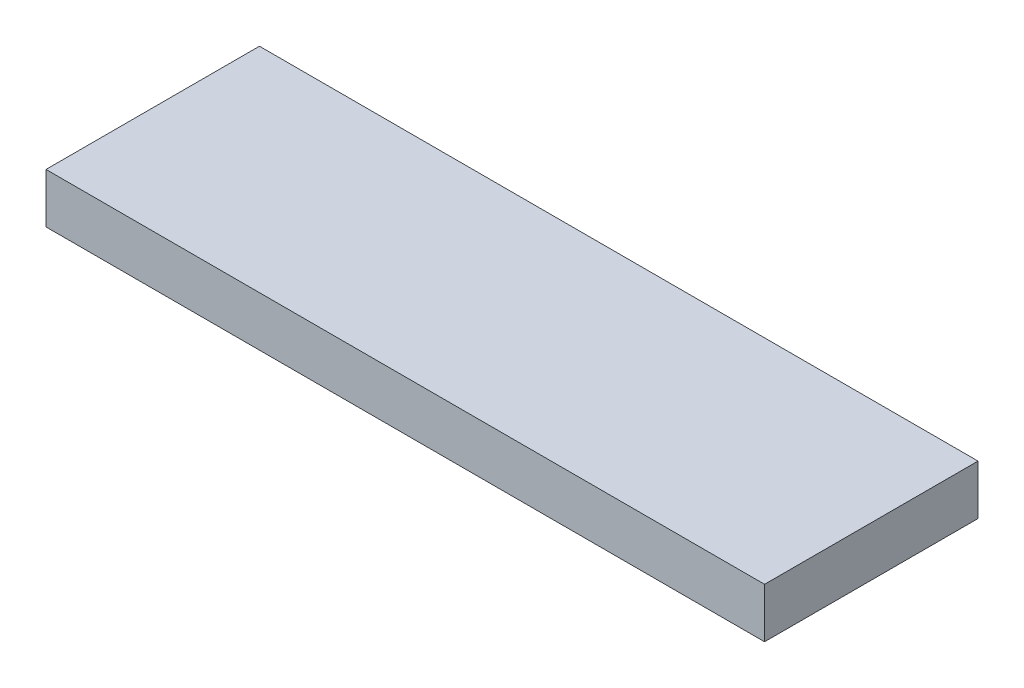
ISO-10303-21;
HEADER;
FILE_DESCRIPTION(('STEP AP214'),'2;1');
FILE_NAME('part.step','',(''),(''),'','','');
FILE_SCHEMA(('AUTOMOTIVE_DESIGN { 1 0 10303 214 1 1 1 1 }'));
ENDSEC;
DATA;
#1=APPLICATION_CONTEXT('core data for automotive mechanical design processes');
#2=APPLICATION_PROTOCOL_DEFINITION('international standard','automotive_design',2000,#1);
#3=PRODUCT_CONTEXT('',#1,'mechanical');
#4=PRODUCT('Part','Part','',(#3));
#5=PRODUCT_RELATED_PRODUCT_CATEGORY('part','',(#4));
#6=PRODUCT_DEFINITION_FORMATION('','',#4);
#7=PRODUCT_DEFINITION_CONTEXT('part definition',#1,'design');
#8=PRODUCT_DEFINITION('design','',#6,#7);
#9=PRODUCT_DEFINITION_SHAPE('','',#8);
#10=(LENGTH_UNIT() NAMED_UNIT(*) SI_UNIT(.MILLI.,.METRE.));
#11=(NAMED_UNIT(*) PLANE_ANGLE_UNIT() SI_UNIT($,.RADIAN.));
#12=(NAMED_UNIT(*) SI_UNIT($,.STERADIAN.) SOLID_ANGLE_UNIT());
#13=UNCERTAINTY_MEASURE_WITH_UNIT(LENGTH_MEASURE(1.E-05),#10,'distance_accuracy_value','');
#14=(GEOMETRIC_REPRESENTATION_CONTEXT(3) GLOBAL_UNCERTAINTY_ASSIGNED_CONTEXT((#13)) GLOBAL_UNIT_ASSIGNED_CONTEXT((#10,
#11,#12)) REPRESENTATION_CONTEXT('',''));
#15=CARTESIAN_POINT('',(0.,0.,0.));
#16=DIRECTION('',(0.,0.,1.));
#17=DIRECTION('',(1.,0.,0.));
#18=AXIS2_PLACEMENT_3D('',#15,#16,#17);
#19=CARTESIAN_POINT('',(538.999999999999,-40.,-1170.));
#20=DIRECTION('',(0.,-1.,0.));
#21=DIRECTION('',(0.,0.,-1.));
#22=AXIS2_PLACEMENT_3D('',#19,#20,#21);
#23=CYLINDRICAL_SURFACE('',#22,4.);
#24=CARTESIAN_POINT('',(538.999999999999,-40.,-1170.));
#25=DIRECTION('',(0.,-1.,0.));
#26=DIRECTION('',(0.,0.,-1.));
#27=AXIS2_PLACEMENT_3D('',#24,#25,#26);
#28=CIRCLE('',#27,4.);
#29=CARTESIAN_POINT('',(538.999999999999,-40.,-1174.));
#30=VERTEX_POINT('',#29);
#31=EDGE_CURVE('E104',#30,#30,#28,.F.);
#32=ORIENTED_EDGE('',*,*,#31,.F.);
#33=EDGE_LOOP('',(#32));
#34=FACE_BOUND('',#33,.T.);
#35=CARTESIAN_POINT('',(538.999999999999,-30.,-1170.));
#36=DIRECTION('',(0.,-1.,0.));
#37=DIRECTION('',(0.,0.,-1.));
#38=AXIS2_PLACEMENT_3D('',#35,#36,#37);
#39=CIRCLE('',#38,4.);
#40=CARTESIAN_POINT('',(538.999999999999,-30.,-1174.));
#41=VERTEX_POINT('',#40);
#42=EDGE_CURVE('E45',#41,#41,#39,.T.);
#43=ORIENTED_EDGE('',*,*,#42,.F.);
#44=EDGE_LOOP('',(#43));
#45=FACE_BOUND('',#44,.T.);
#46=ADVANCED_FACE('F42',(#34,#45),#23,.F.);
#47=CARTESIAN_POINT('',(469.,-40.,-1170.));
#48=DIRECTION('',(0.,-1.,0.));
#49=DIRECTION('',(0.,0.,-1.));
#50=AXIS2_PLACEMENT_3D('',#47,#48,#49);
#51=CYLINDRICAL_SURFACE('',#50,3.40000000000007);
#52=CARTESIAN_POINT('',(469.,-40.,-1170.));
#53=DIRECTION('',(0.,-1.,0.));
#54=DIRECTION('',(0.,0.,-1.));
#55=AXIS2_PLACEMENT_3D('',#52,#53,#54);
#56=CIRCLE('',#55,3.40000000000007);
#57=CARTESIAN_POINT('',(469.,-40.,-1173.4));
#58=VERTEX_POINT('',#57);
#59=EDGE_CURVE('E131',#58,#58,#56,.F.);
#60=ORIENTED_EDGE('',*,*,#59,.F.);
#61=EDGE_LOOP('',(#60));
#62=FACE_BOUND('',#61,.T.);
#63=CARTESIAN_POINT('',(469.,-30.,-1170.));
#64=DIRECTION('',(0.,-1.,0.));
#65=DIRECTION('',(0.,0.,-1.));
#66=AXIS2_PLACEMENT_3D('',#63,#64,#65);
#67=CIRCLE('',#66,3.40000000000007);
#68=CARTESIAN_POINT('',(469.,-30.,-1173.4));
#69=VERTEX_POINT('',#68);
#70=EDGE_CURVE('E137',#69,#69,#67,.T.);
#71=ORIENTED_EDGE('',*,*,#70,.F.);
#72=EDGE_LOOP('',(#71));
#73=FACE_BOUND('',#72,.T.);
#74=ADVANCED_FACE('F147',(#62,#73),#51,.F.);
#75=CARTESIAN_POINT('',(609.,-40.,-1170.));
#76=DIRECTION('',(0.,-1.,0.));
#77=DIRECTION('',(0.,0.,-1.));
#78=AXIS2_PLACEMENT_3D('',#75,#76,#77);
#79=CYLINDRICAL_SURFACE('',#78,3.40000000000007);
#80=CARTESIAN_POINT('',(609.,-40.,-1170.));
#81=DIRECTION('',(0.,-1.,0.));
#82=DIRECTION('',(0.,0.,-1.));
#83=AXIS2_PLACEMENT_3D('',#80,#81,#82);
#84=CIRCLE('',#83,3.40000000000007);
#85=CARTESIAN_POINT('',(609.,-40.,-1173.4));
#86=VERTEX_POINT('',#85);
#87=EDGE_CURVE('E123',#86,#86,#84,.F.);
#88=ORIENTED_EDGE('',*,*,#87,.F.);
#89=EDGE_LOOP('',(#88));
#90=FACE_BOUND('',#89,.T.);
#91=CARTESIAN_POINT('',(609.,-30.,-1170.));
#92=DIRECTION('',(0.,-1.,0.));
#93=DIRECTION('',(0.,0.,-1.));
#94=AXIS2_PLACEMENT_3D('',#91,#92,#93);
#95=CIRCLE('',#94,3.40000000000007);
#96=CARTESIAN_POINT('',(609.,-30.,-1173.4));
#97=VERTEX_POINT('',#96);
#98=EDGE_CURVE('E128',#97,#97,#95,.T.);
#99=ORIENTED_EDGE('',*,*,#98,.F.);
#100=EDGE_LOOP('',(#99));
#101=FACE_BOUND('',#100,.T.);
#102=ADVANCED_FACE('F152',(#90,#101),#79,.F.);
#103=CARTESIAN_POINT('',(640.,-40.,-1140.));
#104=DIRECTION('',(0.,0.,-1.));
#105=DIRECTION('',(0.,1.,0.));
#106=AXIS2_PLACEMENT_3D('',#103,#104,#105);
#107=PLANE('',#106);
#108=DIRECTION('',(0.,1.,0.));
#109=VECTOR('',#108,1.);
#110=CARTESIAN_POINT('',(438.,-40.,-1140.));
#111=LINE('',#110,#109);
#112=CARTESIAN_POINT('',(438.,-26.,-1140.));
#113=VERTEX_POINT('',#112);
#114=CARTESIAN_POINT('',(438.,-40.,-1140.));
#115=VERTEX_POINT('',#114);
#116=EDGE_CURVE('E84',#113,#115,#111,.F.);
#117=ORIENTED_EDGE('',*,*,#116,.T.);
#118=DIRECTION('',(1.,0.,0.));
#119=VECTOR('',#118,1.);
#120=CARTESIAN_POINT('',(0.,-40.,-1140.));
#121=LINE('',#120,#119);
#122=CARTESIAN_POINT('',(640.,-40.,-1140.));
#123=VERTEX_POINT('',#122);
#124=EDGE_CURVE('E75',#123,#115,#121,.F.);
#125=ORIENTED_EDGE('',*,*,#124,.F.);
#126=DIRECTION('',(0.,1.,0.));
#127=VECTOR('',#126,1.);
#128=CARTESIAN_POINT('',(640.,-40.,-1140.));
#129=LINE('',#128,#127);
#130=CARTESIAN_POINT('',(640.,-26.,-1140.));
#131=VERTEX_POINT('',#130);
#132=EDGE_CURVE('E98',#123,#131,#129,.T.);
#133=ORIENTED_EDGE('',*,*,#132,.T.);
#134=DIRECTION('',(1.,0.,0.));
#135=VECTOR('',#134,1.);
#136=CARTESIAN_POINT('',(438.,-26.,-1140.));
#137=LINE('',#136,#135);
#138=EDGE_CURVE('E102',#113,#131,#137,.T.);
#139=ORIENTED_EDGE('',*,*,#138,.F.);
#140=EDGE_LOOP('',(#117,#125,#133,#139));
#141=FACE_BOUND('',#140,.T.);
#142=ADVANCED_FACE('F100',(#141),#107,.F.);
#143=CARTESIAN_POINT('',(438.,-40.,-1140.));
#144=DIRECTION('',(1.,0.,0.));
#145=DIRECTION('',(0.,0.,-1.));
#146=AXIS2_PLACEMENT_3D('',#143,#144,#145);
#147=PLANE('',#146);
#148=DIRECTION('',(0.,-1.,0.));
#149=VECTOR('',#148,1.);
#150=CARTESIAN_POINT('',(438.,-40.,-1200.));
#151=LINE('',#150,#149);
#152=CARTESIAN_POINT('',(438.,-26.,-1200.));
#153=VERTEX_POINT('',#152);
#154=CARTESIAN_POINT('',(438.,-40.,-1200.));
#155=VERTEX_POINT('',#154);
#156=EDGE_CURVE('E91',#153,#155,#151,.T.);
#157=ORIENTED_EDGE('',*,*,#156,.T.);
#158=DIRECTION('',(0.,0.,-1.));
#159=VECTOR('',#158,1.);
#160=CARTESIAN_POINT('',(438.,-40.,0.));
#161=LINE('',#160,#159);
#162=EDGE_CURVE('E120',#115,#155,#161,.T.);
#163=ORIENTED_EDGE('',*,*,#162,.F.);
#164=ORIENTED_EDGE('',*,*,#116,.F.);
#165=DIRECTION('',(0.,0.,1.));
#166=VECTOR('',#165,1.);
#167=CARTESIAN_POINT('',(438.,-26.,-1200.));
#168=LINE('',#167,#166);
#169=EDGE_CURVE('E113',#153,#113,#168,.T.);
#170=ORIENTED_EDGE('',*,*,#169,.F.);
#171=EDGE_LOOP('',(#157,#163,#164,#170));
#172=FACE_BOUND('',#171,.T.);
#173=ADVANCED_FACE('F173',(#172),#147,.F.);
#174=CARTESIAN_POINT('',(640.,-40.,-1200.));
#175=DIRECTION('',(0.,0.,1.));
#176=DIRECTION('',(0.,-1.,0.));
#177=AXIS2_PLACEMENT_3D('',#174,#175,#176);
#178=PLANE('',#177);
#179=DIRECTION('',(0.,1.,0.));
#180=VECTOR('',#179,1.);
#181=CARTESIAN_POINT('',(640.,-40.,-1200.));
#182=LINE('',#181,#180);
#183=CARTESIAN_POINT('',(640.,-26.,-1200.));
#184=VERTEX_POINT('',#183);
#185=CARTESIAN_POINT('',(640.,-40.,-1200.));
#186=VERTEX_POINT('',#185);
#187=EDGE_CURVE('E62',#184,#186,#182,.F.);
#188=ORIENTED_EDGE('',*,*,#187,.T.);
#189=DIRECTION('',(1.,0.,0.));
#190=VECTOR('',#189,1.);
#191=CARTESIAN_POINT('',(0.,-40.,-1200.));
#192=LINE('',#191,#190);
#193=EDGE_CURVE('E51',#155,#186,#192,.T.);
#194=ORIENTED_EDGE('',*,*,#193,.F.);
#195=ORIENTED_EDGE('',*,*,#156,.F.);
#196=DIRECTION('',(-1.,0.,0.));
#197=VECTOR('',#196,1.);
#198=CARTESIAN_POINT('',(640.,-26.,-1200.));
#199=LINE('',#198,#197);
#200=EDGE_CURVE('E110',#184,#153,#199,.T.);
#201=ORIENTED_EDGE('',*,*,#200,.F.);
#202=EDGE_LOOP('',(#188,#194,#195,#201));
#203=FACE_BOUND('',#202,.T.);
#204=ADVANCED_FACE('F166',(#203),#178,.F.);
#205=CARTESIAN_POINT('',(640.,-40.,-1140.));
#206=DIRECTION('',(-1.,0.,0.));
#207=DIRECTION('',(0.,0.,1.));
#208=AXIS2_PLACEMENT_3D('',#205,#206,#207);
#209=PLANE('',#208);
#210=ORIENTED_EDGE('',*,*,#132,.F.);
#211=DIRECTION('',(0.,0.,-1.));
#212=VECTOR('',#211,1.);
#213=CARTESIAN_POINT('',(640.,-40.,0.));
#214=LINE('',#213,#212);
#215=EDGE_CURVE('E11',#186,#123,#214,.F.);
#216=ORIENTED_EDGE('',*,*,#215,.F.);
#217=ORIENTED_EDGE('',*,*,#187,.F.);
#218=DIRECTION('',(0.,0.,-1.));
#219=VECTOR('',#218,1.);
#220=CARTESIAN_POINT('',(640.,-26.,-1140.));
#221=LINE('',#220,#219);
#222=EDGE_CURVE('E107',#131,#184,#221,.T.);
#223=ORIENTED_EDGE('',*,*,#222,.F.);
#224=EDGE_LOOP('',(#210,#216,#217,#223));
#225=FACE_BOUND('',#224,.T.);
#226=ADVANCED_FACE('F108',(#225),#209,.F.);
#227=CARTESIAN_POINT('',(0.,-40.,0.));
#228=DIRECTION('',(0.,-1.,0.));
#229=DIRECTION('',(0.,0.,-1.));
#230=AXIS2_PLACEMENT_3D('',#227,#228,#229);
#231=PLANE('',#230);
#232=ORIENTED_EDGE('',*,*,#193,.T.);
#233=ORIENTED_EDGE('',*,*,#215,.T.);
#234=ORIENTED_EDGE('',*,*,#124,.T.);
#235=ORIENTED_EDGE('',*,*,#162,.T.);
#236=EDGE_LOOP('',(#232,#233,#234,#235));
#237=FACE_BOUND('',#236,.T.);
#238=ORIENTED_EDGE('',*,*,#87,.T.);
#239=EDGE_LOOP('',(#238));
#240=FACE_BOUND('',#239,.T.);
#241=ORIENTED_EDGE('',*,*,#59,.T.);
#242=EDGE_LOOP('',(#241));
#243=FACE_BOUND('',#242,.T.);
#244=ORIENTED_EDGE('',*,*,#31,.T.);
#245=EDGE_LOOP('',(#244));
#246=FACE_BOUND('',#245,.T.);
#247=ADVANCED_FACE('F157',(#237,#240,#243,#246),#231,.T.);
#248=CARTESIAN_POINT('',(0.,-30.,0.));
#249=DIRECTION('',(0.,1.,0.));
#250=DIRECTION('',(0.,0.,1.));
#251=AXIS2_PLACEMENT_3D('',#248,#249,#250);
#252=PLANE('',#251);
#253=ORIENTED_EDGE('',*,*,#42,.T.);
#254=EDGE_LOOP('',(#253));
#255=FACE_BOUND('',#254,.T.);
#256=ADVANCED_FACE('F144',(#255),#252,.F.);
#257=ORIENTED_EDGE('',*,*,#70,.T.);
#258=EDGE_LOOP('',(#257));
#259=FACE_BOUND('',#258,.T.);
#260=ADVANCED_FACE('F156',(#259),#252,.F.);
#261=ORIENTED_EDGE('',*,*,#98,.T.);
#262=EDGE_LOOP('',(#261));
#263=FACE_BOUND('',#262,.T.);
#264=ADVANCED_FACE('F159',(#263),#252,.F.);
#265=CARTESIAN_POINT('',(0.,-26.,0.));
#266=DIRECTION('',(0.,1.,0.));
#267=DIRECTION('',(0.,0.,1.));
#268=AXIS2_PLACEMENT_3D('',#265,#266,#267);
#269=PLANE('',#268);
#270=ORIENTED_EDGE('',*,*,#138,.T.);
#271=ORIENTED_EDGE('',*,*,#222,.T.);
#272=ORIENTED_EDGE('',*,*,#200,.T.);
#273=ORIENTED_EDGE('',*,*,#169,.T.);
#274=EDGE_LOOP('',(#270,#271,#272,#273));
#275=FACE_BOUND('',#274,.T.);
#276=ADVANCED_FACE('F112',(#275),#269,.T.);
#277=CLOSED_SHELL('',(#46,#74,#102,#142,#173,#204,#226,#247,#256,#260,#264,#276));
#278=MANIFOLD_SOLID_BREP('B2',#277);
#279=ADVANCED_BREP_SHAPE_REPRESENTATION('',(#18,#278),#14);
#280=SHAPE_DEFINITION_REPRESENTATION(#9,#279);
ENDSEC;
END-ISO-10303-21;
